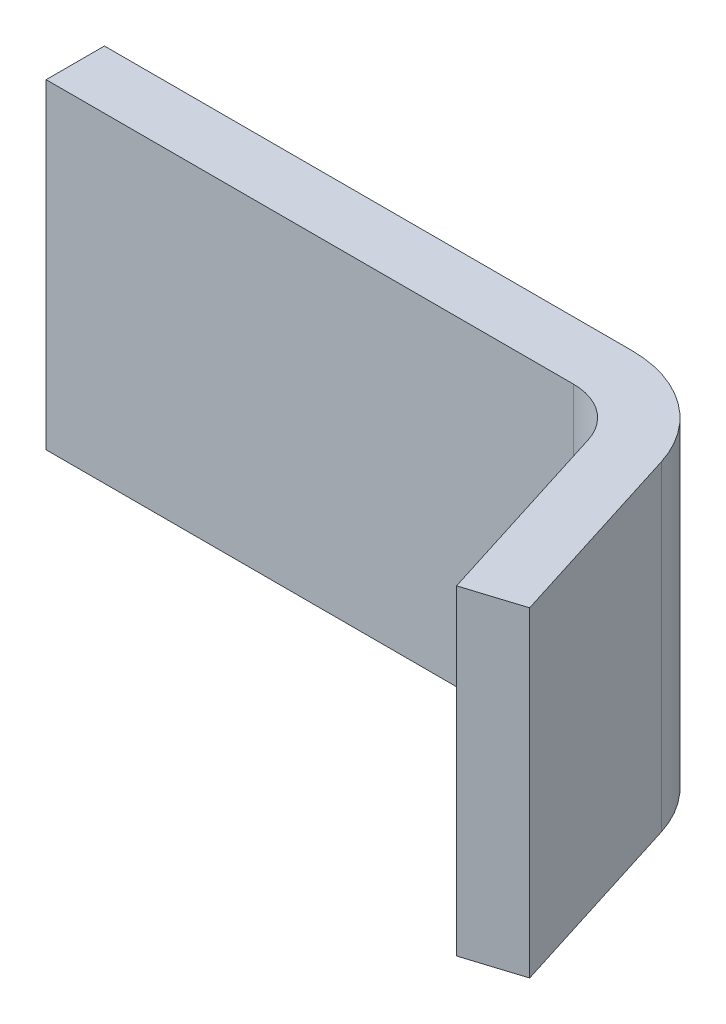
ISO-10303-21;
HEADER;
FILE_DESCRIPTION(('STEP AP214'),'2;1');
FILE_NAME('part.step','',(''),(''),'','','');
FILE_SCHEMA(('AUTOMOTIVE_DESIGN { 1 0 10303 214 1 1 1 1 }'));
ENDSEC;
DATA;
#1=APPLICATION_CONTEXT('core data for automotive mechanical design processes');
#2=APPLICATION_PROTOCOL_DEFINITION('international standard','automotive_design',2000,#1);
#3=PRODUCT_CONTEXT('',#1,'mechanical');
#4=PRODUCT('Part','Part','',(#3));
#5=PRODUCT_RELATED_PRODUCT_CATEGORY('part','',(#4));
#6=PRODUCT_DEFINITION_FORMATION('','',#4);
#7=PRODUCT_DEFINITION_CONTEXT('part definition',#1,'design');
#8=PRODUCT_DEFINITION('design','',#6,#7);
#9=PRODUCT_DEFINITION_SHAPE('','',#8);
#10=(LENGTH_UNIT() NAMED_UNIT(*) SI_UNIT(.MILLI.,.METRE.));
#11=(NAMED_UNIT(*) PLANE_ANGLE_UNIT() SI_UNIT($,.RADIAN.));
#12=(NAMED_UNIT(*) SI_UNIT($,.STERADIAN.) SOLID_ANGLE_UNIT());
#13=UNCERTAINTY_MEASURE_WITH_UNIT(LENGTH_MEASURE(1.E-05),#10,'distance_accuracy_value','');
#14=(GEOMETRIC_REPRESENTATION_CONTEXT(3) GLOBAL_UNCERTAINTY_ASSIGNED_CONTEXT((#13)) GLOBAL_UNIT_ASSIGNED_CONTEXT((#10,
#11,#12)) REPRESENTATION_CONTEXT('',''));
#15=CARTESIAN_POINT('',(0.,0.,0.));
#16=DIRECTION('',(0.,0.,1.));
#17=DIRECTION('',(1.,0.,0.));
#18=AXIS2_PLACEMENT_3D('',#15,#16,#17);
#19=CARTESIAN_POINT('',(0.,0.275,0.1));
#20=DIRECTION('',(0.,-1.,0.));
#21=DIRECTION('',(0.,0.,-1.));
#22=AXIS2_PLACEMENT_3D('',#19,#20,#21);
#23=PLANE('',#22);
#24=DIRECTION('',(0.,0.,1.));
#25=VECTOR('',#24,1.);
#26=CARTESIAN_POINT('',(-0.904628304925177,0.275,0.));
#27=LINE('',#26,#25);
#28=CARTESIAN_POINT('',(-0.904628304925177,0.275,-0.1));
#29=VERTEX_POINT('',#28);
#30=CARTESIAN_POINT('',(-0.904628304925177,0.275,0.));
#31=VERTEX_POINT('',#30);
#32=EDGE_CURVE('E146',#29,#31,#27,.T.);
#33=ORIENTED_EDGE('',*,*,#32,.T.);
#34=DIRECTION('',(1.,0.,0.));
#35=VECTOR('',#34,1.);
#36=CARTESIAN_POINT('',(-0.904628304925177,0.275,0.));
#37=LINE('',#36,#35);
#38=CARTESIAN_POINT('',(0.,0.275,0.));
#39=VERTEX_POINT('',#38);
#40=EDGE_CURVE('E67',#31,#39,#37,.T.);
#41=ORIENTED_EDGE('',*,*,#40,.T.);
#42=CARTESIAN_POINT('',(0.,0.275,0.1));
#43=DIRECTION('',(0.,-1.,0.));
#44=DIRECTION('',(1.,0.,0.));
#45=AXIS2_PLACEMENT_3D('',#42,#43,#44);
#46=CIRCLE('',#45,0.1);
#47=CARTESIAN_POINT('',(0.0953716950748227,0.275,0.0699294200495726));
#48=VERTEX_POINT('',#47);
#49=EDGE_CURVE('E165',#39,#48,#46,.T.);
#50=ORIENTED_EDGE('',*,*,#49,.T.);
#51=DIRECTION('',(0.300705799504273,0.,0.953716950748227));
#52=VECTOR('',#51,1.);
#53=CARTESIAN_POINT('',(0.0953716950748227,0.275,0.0699294200495727));
#54=LINE('',#53,#52);
#55=CARTESIAN_POINT('',(0.199442549177777,0.275,0.4));
#56=VERTEX_POINT('',#55);
#57=EDGE_CURVE('E140',#48,#56,#54,.T.);
#58=ORIENTED_EDGE('',*,*,#57,.T.);
#59=DIRECTION('',(0.953716950748227,0.,-0.300705799504273));
#60=VECTOR('',#59,1.);
#61=CARTESIAN_POINT('',(0.199442549177777,0.275,0.4));
#62=LINE('',#61,#60);
#63=CARTESIAN_POINT('',(0.294814244252599,0.275,0.369929420049573));
#64=VERTEX_POINT('',#63);
#65=EDGE_CURVE('E120',#56,#64,#62,.T.);
#66=ORIENTED_EDGE('',*,*,#65,.T.);
#67=DIRECTION('',(-0.300705799504273,0.,-0.953716950748227));
#68=VECTOR('',#67,1.);
#69=CARTESIAN_POINT('',(0.190743390149646,0.275,0.0398588400991453));
#70=LINE('',#69,#68);
#71=CARTESIAN_POINT('',(0.190743390149646,0.275,0.0398588400991453));
#72=VERTEX_POINT('',#71);
#73=EDGE_CURVE('E161',#64,#72,#70,.T.);
#74=ORIENTED_EDGE('',*,*,#73,.T.);
#75=CARTESIAN_POINT('',(0.,0.275,0.1));
#76=DIRECTION('',(0.,1.,0.));
#77=DIRECTION('',(1.,0.,0.));
#78=AXIS2_PLACEMENT_3D('',#75,#76,#77);
#79=CIRCLE('',#78,0.2);
#80=CARTESIAN_POINT('',(0.,0.275,-0.1));
#81=VERTEX_POINT('',#80);
#82=EDGE_CURVE('E173',#72,#81,#79,.T.);
#83=ORIENTED_EDGE('',*,*,#82,.T.);
#84=DIRECTION('',(-1.,0.,0.));
#85=VECTOR('',#84,1.);
#86=CARTESIAN_POINT('',(-0.904628304925177,0.275,-0.1));
#87=LINE('',#86,#85);
#88=EDGE_CURVE('E27',#81,#29,#87,.T.);
#89=ORIENTED_EDGE('',*,*,#88,.T.);
#90=EDGE_LOOP('',(#33,#41,#50,#58,#66,#74,#83,#89));
#91=FACE_BOUND('',#90,.T.);
#92=ADVANCED_FACE('F16',(#91),#23,.F.);
#93=CARTESIAN_POINT('',(0.,-0.275,0.1));
#94=DIRECTION('',(0.,-1.,0.));
#95=DIRECTION('',(0.,0.,-1.));
#96=AXIS2_PLACEMENT_3D('',#93,#94,#95);
#97=PLANE('',#96);
#98=DIRECTION('',(0.,0.,1.));
#99=VECTOR('',#98,1.);
#100=CARTESIAN_POINT('',(-0.904628304925177,-0.275,0.));
#101=LINE('',#100,#99);
#102=CARTESIAN_POINT('',(-0.904628304925177,-0.275,-0.1));
#103=VERTEX_POINT('',#102);
#104=CARTESIAN_POINT('',(-0.904628304925177,-0.275,0.));
#105=VERTEX_POINT('',#104);
#106=EDGE_CURVE('E159',#103,#105,#101,.T.);
#107=ORIENTED_EDGE('',*,*,#106,.F.);
#108=DIRECTION('',(-1.,0.,0.));
#109=VECTOR('',#108,1.);
#110=CARTESIAN_POINT('',(-0.904628304925177,-0.275,-0.1));
#111=LINE('',#110,#109);
#112=CARTESIAN_POINT('',(0.,-0.275,-0.1));
#113=VERTEX_POINT('',#112);
#114=EDGE_CURVE('E11',#113,#103,#111,.T.);
#115=ORIENTED_EDGE('',*,*,#114,.F.);
#116=CARTESIAN_POINT('',(0.,-0.275,0.1));
#117=DIRECTION('',(0.,1.,0.));
#118=DIRECTION('',(1.,0.,0.));
#119=AXIS2_PLACEMENT_3D('',#116,#117,#118);
#120=CIRCLE('',#119,0.2);
#121=CARTESIAN_POINT('',(0.190743390149646,-0.275,0.0398588400991453));
#122=VERTEX_POINT('',#121);
#123=EDGE_CURVE('E176',#122,#113,#120,.T.);
#124=ORIENTED_EDGE('',*,*,#123,.F.);
#125=DIRECTION('',(-0.300705799504273,0.,-0.953716950748227));
#126=VECTOR('',#125,1.);
#127=CARTESIAN_POINT('',(0.190743390149646,-0.275,0.0398588400991453));
#128=LINE('',#127,#126);
#129=CARTESIAN_POINT('',(0.294814244252599,-0.275,0.369929420049573));
#130=VERTEX_POINT('',#129);
#131=EDGE_CURVE('E114',#130,#122,#128,.T.);
#132=ORIENTED_EDGE('',*,*,#131,.F.);
#133=DIRECTION('',(0.953716950748227,0.,-0.300705799504273));
#134=VECTOR('',#133,1.);
#135=CARTESIAN_POINT('',(0.199442549177777,-0.275,0.4));
#136=LINE('',#135,#134);
#137=CARTESIAN_POINT('',(0.199442549177777,-0.275,0.4));
#138=VERTEX_POINT('',#137);
#139=EDGE_CURVE('E106',#138,#130,#136,.T.);
#140=ORIENTED_EDGE('',*,*,#139,.F.);
#141=DIRECTION('',(0.300705799504273,0.,0.953716950748227));
#142=VECTOR('',#141,1.);
#143=CARTESIAN_POINT('',(0.0953716950748227,-0.275,0.0699294200495727));
#144=LINE('',#143,#142);
#145=CARTESIAN_POINT('',(0.0953716950748227,-0.275,0.0699294200495726));
#146=VERTEX_POINT('',#145);
#147=EDGE_CURVE('E111',#146,#138,#144,.T.);
#148=ORIENTED_EDGE('',*,*,#147,.F.);
#149=CARTESIAN_POINT('',(0.,-0.275,0.1));
#150=DIRECTION('',(0.,-1.,0.));
#151=DIRECTION('',(1.,0.,0.));
#152=AXIS2_PLACEMENT_3D('',#149,#150,#151);
#153=CIRCLE('',#152,0.1);
#154=CARTESIAN_POINT('',(0.,-0.275,0.));
#155=VERTEX_POINT('',#154);
#156=EDGE_CURVE('E149',#155,#146,#153,.T.);
#157=ORIENTED_EDGE('',*,*,#156,.F.);
#158=DIRECTION('',(1.,0.,0.));
#159=VECTOR('',#158,1.);
#160=CARTESIAN_POINT('',(-0.904628304925177,-0.275,0.));
#161=LINE('',#160,#159);
#162=EDGE_CURVE('E152',#105,#155,#161,.T.);
#163=ORIENTED_EDGE('',*,*,#162,.F.);
#164=EDGE_LOOP('',(#107,#115,#124,#132,#140,#148,#157,#163));
#165=FACE_BOUND('',#164,.T.);
#166=ADVANCED_FACE('F108',(#165),#97,.T.);
#167=CARTESIAN_POINT('',(-0.904628304925177,-0.275,-0.1));
#168=DIRECTION('',(0.,0.,-1.));
#169=DIRECTION('',(0.,-1.,0.));
#170=AXIS2_PLACEMENT_3D('',#167,#168,#169);
#171=PLANE('',#170);
#172=ORIENTED_EDGE('',*,*,#88,.F.);
#173=DIRECTION('',(0.,1.,0.));
#174=VECTOR('',#173,1.);
#175=CARTESIAN_POINT('',(0.,-0.275,-0.1));
#176=LINE('',#175,#174);
#177=EDGE_CURVE('E20',#113,#81,#176,.T.);
#178=ORIENTED_EDGE('',*,*,#177,.F.);
#179=ORIENTED_EDGE('',*,*,#114,.T.);
#180=DIRECTION('',(0.,1.,0.));
#181=VECTOR('',#180,1.);
#182=CARTESIAN_POINT('',(-0.904628304925177,-0.275,-0.1));
#183=LINE('',#182,#181);
#184=EDGE_CURVE('E148',#103,#29,#183,.T.);
#185=ORIENTED_EDGE('',*,*,#184,.T.);
#186=EDGE_LOOP('',(#172,#178,#179,#185));
#187=FACE_BOUND('',#186,.T.);
#188=ADVANCED_FACE('F216',(#187),#171,.T.);
#189=CARTESIAN_POINT('',(0.,-0.275,0.1));
#190=DIRECTION('',(0.,-1.,0.));
#191=DIRECTION('',(0.,0.,1.));
#192=AXIS2_PLACEMENT_3D('',#189,#190,#191);
#193=CYLINDRICAL_SURFACE('',#192,0.2);
#194=ORIENTED_EDGE('',*,*,#82,.F.);
#195=DIRECTION('',(0.,1.,0.));
#196=VECTOR('',#195,1.);
#197=CARTESIAN_POINT('',(0.190743390149646,-0.275,0.0398588400991453));
#198=LINE('',#197,#196);
#199=EDGE_CURVE('E144',#122,#72,#198,.T.);
#200=ORIENTED_EDGE('',*,*,#199,.F.);
#201=ORIENTED_EDGE('',*,*,#123,.T.);
#202=ORIENTED_EDGE('',*,*,#177,.T.);
#203=EDGE_LOOP('',(#194,#200,#201,#202));
#204=FACE_BOUND('',#203,.T.);
#205=ADVANCED_FACE('F207',(#204),#193,.T.);
#206=CARTESIAN_POINT('',(0.190743390149646,-0.275,0.0398588400991453));
#207=DIRECTION('',(0.953716950748227,0.,-0.300705799504273));
#208=DIRECTION('',(0.,-1.,0.));
#209=AXIS2_PLACEMENT_3D('',#206,#207,#208);
#210=PLANE('',#209);
#211=ORIENTED_EDGE('',*,*,#73,.F.);
#212=DIRECTION('',(0.,1.,0.));
#213=VECTOR('',#212,1.);
#214=CARTESIAN_POINT('',(0.294814244252599,-0.275,0.369929420049573));
#215=LINE('',#214,#213);
#216=EDGE_CURVE('E119',#130,#64,#215,.T.);
#217=ORIENTED_EDGE('',*,*,#216,.F.);
#218=ORIENTED_EDGE('',*,*,#131,.T.);
#219=ORIENTED_EDGE('',*,*,#199,.T.);
#220=EDGE_LOOP('',(#211,#217,#218,#219));
#221=FACE_BOUND('',#220,.T.);
#222=ADVANCED_FACE('F199',(#221),#210,.T.);
#223=CARTESIAN_POINT('',(-0.904628304925177,-0.275,0.));
#224=DIRECTION('',(0.,0.,1.));
#225=DIRECTION('',(1.,0.,0.));
#226=AXIS2_PLACEMENT_3D('',#223,#224,#225);
#227=PLANE('',#226);
#228=ORIENTED_EDGE('',*,*,#40,.F.);
#229=DIRECTION('',(0.,1.,0.));
#230=VECTOR('',#229,1.);
#231=CARTESIAN_POINT('',(-0.904628304925177,-0.275,0.));
#232=LINE('',#231,#230);
#233=EDGE_CURVE('E153',#105,#31,#232,.T.);
#234=ORIENTED_EDGE('',*,*,#233,.F.);
#235=ORIENTED_EDGE('',*,*,#162,.T.);
#236=DIRECTION('',(0.,1.,0.));
#237=VECTOR('',#236,1.);
#238=CARTESIAN_POINT('',(0.,-0.275,0.));
#239=LINE('',#238,#237);
#240=EDGE_CURVE('E156',#155,#39,#239,.T.);
#241=ORIENTED_EDGE('',*,*,#240,.T.);
#242=EDGE_LOOP('',(#228,#234,#235,#241));
#243=FACE_BOUND('',#242,.T.);
#244=ADVANCED_FACE('F197',(#243),#227,.T.);
#245=CARTESIAN_POINT('',(-0.904628304925177,-0.275,0.));
#246=DIRECTION('',(-1.,0.,0.));
#247=DIRECTION('',(0.,0.,1.));
#248=AXIS2_PLACEMENT_3D('',#245,#246,#247);
#249=PLANE('',#248);
#250=ORIENTED_EDGE('',*,*,#32,.F.);
#251=ORIENTED_EDGE('',*,*,#184,.F.);
#252=ORIENTED_EDGE('',*,*,#106,.T.);
#253=ORIENTED_EDGE('',*,*,#233,.T.);
#254=EDGE_LOOP('',(#250,#251,#252,#253));
#255=FACE_BOUND('',#254,.T.);
#256=ADVANCED_FACE('F194',(#255),#249,.T.);
#257=CARTESIAN_POINT('',(0.,-0.275,0.1));
#258=DIRECTION('',(0.,-1.,0.));
#259=DIRECTION('',(0.,0.,1.));
#260=AXIS2_PLACEMENT_3D('',#257,#258,#259);
#261=CYLINDRICAL_SURFACE('',#260,0.1);
#262=ORIENTED_EDGE('',*,*,#49,.F.);
#263=ORIENTED_EDGE('',*,*,#240,.F.);
#264=ORIENTED_EDGE('',*,*,#156,.T.);
#265=DIRECTION('',(0.,1.,0.));
#266=VECTOR('',#265,1.);
#267=CARTESIAN_POINT('',(0.0953716950748227,-0.275,0.0699294200495726));
#268=LINE('',#267,#266);
#269=EDGE_CURVE('E133',#146,#48,#268,.T.);
#270=ORIENTED_EDGE('',*,*,#269,.T.);
#271=EDGE_LOOP('',(#262,#263,#264,#270));
#272=FACE_BOUND('',#271,.T.);
#273=ADVANCED_FACE('F18',(#272),#261,.F.);
#274=CARTESIAN_POINT('',(0.199442549177777,-0.275,0.4));
#275=DIRECTION('',(0.300705799504273,0.,0.953716950748227));
#276=DIRECTION('',(0.,-1.,0.));
#277=AXIS2_PLACEMENT_3D('',#274,#275,#276);
#278=PLANE('',#277);
#279=ORIENTED_EDGE('',*,*,#65,.F.);
#280=DIRECTION('',(0.,1.,0.));
#281=VECTOR('',#280,1.);
#282=CARTESIAN_POINT('',(0.199442549177777,-0.275,0.4));
#283=LINE('',#282,#281);
#284=EDGE_CURVE('E123',#138,#56,#283,.T.);
#285=ORIENTED_EDGE('',*,*,#284,.F.);
#286=ORIENTED_EDGE('',*,*,#139,.T.);
#287=ORIENTED_EDGE('',*,*,#216,.T.);
#288=EDGE_LOOP('',(#279,#285,#286,#287));
#289=FACE_BOUND('',#288,.T.);
#290=ADVANCED_FACE('F124',(#289),#278,.T.);
#291=CARTESIAN_POINT('',(0.0953716950748227,-0.275,0.0699294200495727));
#292=DIRECTION('',(-0.953716950748227,0.,0.300705799504273));
#293=DIRECTION('',(0.,1.,0.));
#294=AXIS2_PLACEMENT_3D('',#291,#292,#293);
#295=PLANE('',#294);
#296=ORIENTED_EDGE('',*,*,#57,.F.);
#297=ORIENTED_EDGE('',*,*,#269,.F.);
#298=ORIENTED_EDGE('',*,*,#147,.T.);
#299=ORIENTED_EDGE('',*,*,#284,.T.);
#300=EDGE_LOOP('',(#296,#297,#298,#299));
#301=FACE_BOUND('',#300,.T.);
#302=ADVANCED_FACE('F131',(#301),#295,.T.);
#303=CLOSED_SHELL('',(#92,#166,#188,#205,#222,#244,#256,#273,#290,#302));
#304=MANIFOLD_SOLID_BREP('B1',#303);
#305=ADVANCED_BREP_SHAPE_REPRESENTATION('',(#18,#304),#14);
#306=SHAPE_DEFINITION_REPRESENTATION(#9,#305);
ENDSEC;
END-ISO-10303-21;
